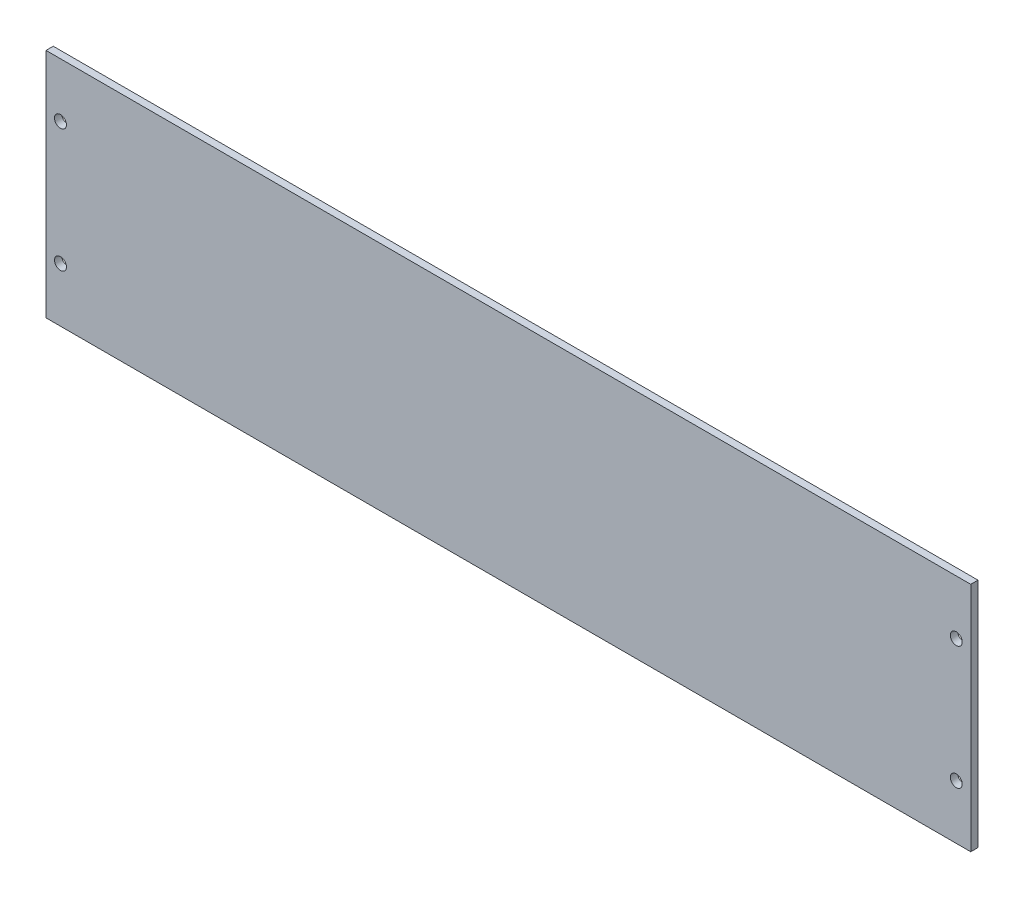
ISO-10303-21;
HEADER;
FILE_DESCRIPTION(('STEP AP214'),'2;1');
FILE_NAME('part.step','',(''),(''),'','','');
FILE_SCHEMA(('AUTOMOTIVE_DESIGN { 1 0 10303 214 1 1 1 1 }'));
ENDSEC;
DATA;
#1=APPLICATION_CONTEXT('core data for automotive mechanical design processes');
#2=APPLICATION_PROTOCOL_DEFINITION('international standard','automotive_design',2000,#1);
#3=PRODUCT_CONTEXT('',#1,'mechanical');
#4=PRODUCT('Part','Part','',(#3));
#5=PRODUCT_RELATED_PRODUCT_CATEGORY('part','',(#4));
#6=PRODUCT_DEFINITION_FORMATION('','',#4);
#7=PRODUCT_DEFINITION_CONTEXT('part definition',#1,'design');
#8=PRODUCT_DEFINITION('design','',#6,#7);
#9=PRODUCT_DEFINITION_SHAPE('','',#8);
#10=(LENGTH_UNIT() NAMED_UNIT(*) SI_UNIT(.MILLI.,.METRE.));
#11=(NAMED_UNIT(*) PLANE_ANGLE_UNIT() SI_UNIT($,.RADIAN.));
#12=(NAMED_UNIT(*) SI_UNIT($,.STERADIAN.) SOLID_ANGLE_UNIT());
#13=UNCERTAINTY_MEASURE_WITH_UNIT(LENGTH_MEASURE(1.E-05),#10,'distance_accuracy_value','');
#14=(GEOMETRIC_REPRESENTATION_CONTEXT(3) GLOBAL_UNCERTAINTY_ASSIGNED_CONTEXT((#13)) GLOBAL_UNIT_ASSIGNED_CONTEXT((#10,
#11,#12)) REPRESENTATION_CONTEXT('',''));
#15=CARTESIAN_POINT('',(0.,0.,0.));
#16=DIRECTION('',(0.,0.,1.));
#17=DIRECTION('',(1.,0.,0.));
#18=AXIS2_PLACEMENT_3D('',#15,#16,#17);
#19=CARTESIAN_POINT('',(255.5,-64.,4.));
#20=DIRECTION('',(-1.,0.,0.));
#21=DIRECTION('',(0.,0.,1.));
#22=AXIS2_PLACEMENT_3D('',#19,#20,#21);
#23=PLANE('',#22);
#24=DIRECTION('',(0.,1.,0.));
#25=VECTOR('',#24,1.);
#26=CARTESIAN_POINT('',(255.5,-64.,0.));
#27=LINE('',#26,#25);
#28=CARTESIAN_POINT('',(255.5,-64.,0.));
#29=VERTEX_POINT('',#28);
#30=CARTESIAN_POINT('',(255.5,64.,0.));
#31=VERTEX_POINT('',#30);
#32=EDGE_CURVE('E96',#29,#31,#27,.T.);
#33=ORIENTED_EDGE('',*,*,#32,.T.);
#34=DIRECTION('',(0.,0.,-1.));
#35=VECTOR('',#34,1.);
#36=CARTESIAN_POINT('',(255.5,64.,4.));
#37=LINE('',#36,#35);
#38=CARTESIAN_POINT('',(255.5,64.,4.));
#39=VERTEX_POINT('',#38);
#40=EDGE_CURVE('E11',#39,#31,#37,.T.);
#41=ORIENTED_EDGE('',*,*,#40,.F.);
#42=DIRECTION('',(0.,1.,0.));
#43=VECTOR('',#42,1.);
#44=CARTESIAN_POINT('',(255.5,-64.,4.));
#45=LINE('',#44,#43);
#46=CARTESIAN_POINT('',(255.5,-64.,4.));
#47=VERTEX_POINT('',#46);
#48=EDGE_CURVE('E84',#47,#39,#45,.T.);
#49=ORIENTED_EDGE('',*,*,#48,.F.);
#50=DIRECTION('',(0.,0.,-1.));
#51=VECTOR('',#50,1.);
#52=CARTESIAN_POINT('',(255.5,-64.,4.));
#53=LINE('',#52,#51);
#54=EDGE_CURVE('E92',#47,#29,#53,.T.);
#55=ORIENTED_EDGE('',*,*,#54,.T.);
#56=EDGE_LOOP('',(#33,#41,#49,#55));
#57=FACE_BOUND('',#56,.T.);
#58=ADVANCED_FACE('F33',(#57),#23,.F.);
#59=CARTESIAN_POINT('',(-255.5,64.,4.));
#60=DIRECTION('',(0.,-1.,0.));
#61=DIRECTION('',(0.,0.,-1.));
#62=AXIS2_PLACEMENT_3D('',#59,#60,#61);
#63=PLANE('',#62);
#64=DIRECTION('',(-1.,0.,0.));
#65=VECTOR('',#64,1.);
#66=CARTESIAN_POINT('',(-255.5,64.,0.));
#67=LINE('',#66,#65);
#68=CARTESIAN_POINT('',(-255.5,64.,0.));
#69=VERTEX_POINT('',#68);
#70=EDGE_CURVE('E88',#31,#69,#67,.T.);
#71=ORIENTED_EDGE('',*,*,#70,.T.);
#72=DIRECTION('',(0.,0.,-1.));
#73=VECTOR('',#72,1.);
#74=CARTESIAN_POINT('',(-255.5,64.,4.));
#75=LINE('',#74,#73);
#76=CARTESIAN_POINT('',(-255.5,64.,4.));
#77=VERTEX_POINT('',#76);
#78=EDGE_CURVE('E41',#77,#69,#75,.T.);
#79=ORIENTED_EDGE('',*,*,#78,.F.);
#80=DIRECTION('',(-1.,0.,0.));
#81=VECTOR('',#80,1.);
#82=CARTESIAN_POINT('',(-255.5,64.,4.));
#83=LINE('',#82,#81);
#84=EDGE_CURVE('E79',#39,#77,#83,.T.);
#85=ORIENTED_EDGE('',*,*,#84,.F.);
#86=ORIENTED_EDGE('',*,*,#40,.T.);
#87=EDGE_LOOP('',(#71,#79,#85,#86));
#88=FACE_BOUND('',#87,.T.);
#89=ADVANCED_FACE('F87',(#88),#63,.F.);
#90=CARTESIAN_POINT('',(-255.5,-64.,4.));
#91=DIRECTION('',(1.,0.,0.));
#92=DIRECTION('',(0.,0.,-1.));
#93=AXIS2_PLACEMENT_3D('',#90,#91,#92);
#94=PLANE('',#93);
#95=DIRECTION('',(0.,-1.,0.));
#96=VECTOR('',#95,1.);
#97=CARTESIAN_POINT('',(-255.5,-64.,0.));
#98=LINE('',#97,#96);
#99=CARTESIAN_POINT('',(-255.5,-64.,0.));
#100=VERTEX_POINT('',#99);
#101=EDGE_CURVE('E66',#69,#100,#98,.T.);
#102=ORIENTED_EDGE('',*,*,#101,.T.);
#103=DIRECTION('',(0.,0.,-1.));
#104=VECTOR('',#103,1.);
#105=CARTESIAN_POINT('',(-255.5,-64.,4.));
#106=LINE('',#105,#104);
#107=CARTESIAN_POINT('',(-255.5,-64.,4.));
#108=VERTEX_POINT('',#107);
#109=EDGE_CURVE('E89',#108,#100,#106,.T.);
#110=ORIENTED_EDGE('',*,*,#109,.F.);
#111=DIRECTION('',(0.,-1.,0.));
#112=VECTOR('',#111,1.);
#113=CARTESIAN_POINT('',(-255.5,-64.,4.));
#114=LINE('',#113,#112);
#115=EDGE_CURVE('E82',#77,#108,#114,.T.);
#116=ORIENTED_EDGE('',*,*,#115,.F.);
#117=ORIENTED_EDGE('',*,*,#78,.T.);
#118=EDGE_LOOP('',(#102,#110,#116,#117));
#119=FACE_BOUND('',#118,.T.);
#120=ADVANCED_FACE('F90',(#119),#94,.F.);
#121=CARTESIAN_POINT('',(-255.5,-64.,4.));
#122=DIRECTION('',(0.,1.,0.));
#123=DIRECTION('',(0.,0.,1.));
#124=AXIS2_PLACEMENT_3D('',#121,#122,#123);
#125=PLANE('',#124);
#126=DIRECTION('',(1.,0.,0.));
#127=VECTOR('',#126,1.);
#128=CARTESIAN_POINT('',(-255.5,-64.,0.));
#129=LINE('',#128,#127);
#130=EDGE_CURVE('E72',#100,#29,#129,.T.);
#131=ORIENTED_EDGE('',*,*,#130,.T.);
#132=ORIENTED_EDGE('',*,*,#54,.F.);
#133=DIRECTION('',(1.,0.,0.));
#134=VECTOR('',#133,1.);
#135=CARTESIAN_POINT('',(-255.5,-64.,4.));
#136=LINE('',#135,#134);
#137=EDGE_CURVE('E49',#108,#47,#136,.T.);
#138=ORIENTED_EDGE('',*,*,#137,.F.);
#139=ORIENTED_EDGE('',*,*,#109,.T.);
#140=EDGE_LOOP('',(#131,#132,#138,#139));
#141=FACE_BOUND('',#140,.T.);
#142=ADVANCED_FACE('F104',(#141),#125,.F.);
#143=CARTESIAN_POINT('',(0.,0.,4.));
#144=DIRECTION('',(0.,0.,-1.));
#145=DIRECTION('',(-1.,0.,0.));
#146=AXIS2_PLACEMENT_3D('',#143,#144,#145);
#147=PLANE('',#146);
#148=CARTESIAN_POINT('',(-247.5,34.,4.));
#149=DIRECTION('',(0.,0.,-1.));
#150=DIRECTION('',(-1.,0.,0.));
#151=AXIS2_PLACEMENT_3D('',#148,#149,#150);
#152=CIRCLE('',#151,3.3);
#153=CARTESIAN_POINT('',(-250.8,34.,4.));
#154=VERTEX_POINT('',#153);
#155=EDGE_CURVE('E127',#154,#154,#152,.T.);
#156=ORIENTED_EDGE('',*,*,#155,.T.);
#157=EDGE_LOOP('',(#156));
#158=FACE_BOUND('',#157,.T.);
#159=CARTESIAN_POINT('',(-247.5,-34.,4.));
#160=DIRECTION('',(0.,0.,-1.));
#161=DIRECTION('',(-1.,0.,0.));
#162=AXIS2_PLACEMENT_3D('',#159,#160,#161);
#163=CIRCLE('',#162,3.3);
#164=CARTESIAN_POINT('',(-250.8,-34.,4.));
#165=VERTEX_POINT('',#164);
#166=EDGE_CURVE('E121',#165,#165,#163,.T.);
#167=ORIENTED_EDGE('',*,*,#166,.T.);
#168=EDGE_LOOP('',(#167));
#169=FACE_BOUND('',#168,.T.);
#170=CARTESIAN_POINT('',(247.5,-34.,4.));
#171=DIRECTION('',(0.,0.,-1.));
#172=DIRECTION('',(-1.,0.,0.));
#173=AXIS2_PLACEMENT_3D('',#170,#171,#172);
#174=CIRCLE('',#173,3.29999999999997);
#175=CARTESIAN_POINT('',(244.2,-34.,4.));
#176=VERTEX_POINT('',#175);
#177=EDGE_CURVE('E115',#176,#176,#174,.T.);
#178=ORIENTED_EDGE('',*,*,#177,.T.);
#179=EDGE_LOOP('',(#178));
#180=FACE_BOUND('',#179,.T.);
#181=CARTESIAN_POINT('',(247.5,34.,4.));
#182=DIRECTION('',(0.,0.,-1.));
#183=DIRECTION('',(-1.,0.,0.));
#184=AXIS2_PLACEMENT_3D('',#181,#182,#183);
#185=CIRCLE('',#184,3.29999999999997);
#186=CARTESIAN_POINT('',(244.2,34.,4.));
#187=VERTEX_POINT('',#186);
#188=EDGE_CURVE('E99',#187,#187,#185,.T.);
#189=ORIENTED_EDGE('',*,*,#188,.T.);
#190=EDGE_LOOP('',(#189));
#191=FACE_BOUND('',#190,.T.);
#192=ORIENTED_EDGE('',*,*,#48,.T.);
#193=ORIENTED_EDGE('',*,*,#84,.T.);
#194=ORIENTED_EDGE('',*,*,#115,.T.);
#195=ORIENTED_EDGE('',*,*,#137,.T.);
#196=EDGE_LOOP('',(#192,#193,#194,#195));
#197=FACE_BOUND('',#196,.T.);
#198=ADVANCED_FACE('F80',(#158,#169,#180,#191,#197),#147,.F.);
#199=CARTESIAN_POINT('',(0.,0.,0.));
#200=DIRECTION('',(0.,0.,-1.));
#201=DIRECTION('',(-1.,0.,0.));
#202=AXIS2_PLACEMENT_3D('',#199,#200,#201);
#203=PLANE('',#202);
#204=CARTESIAN_POINT('',(-247.5,34.,0.));
#205=DIRECTION('',(0.,0.,-1.));
#206=DIRECTION('',(-1.,0.,0.));
#207=AXIS2_PLACEMENT_3D('',#204,#205,#206);
#208=CIRCLE('',#207,3.3);
#209=CARTESIAN_POINT('',(-250.8,34.,0.));
#210=VERTEX_POINT('',#209);
#211=EDGE_CURVE('E130',#210,#210,#208,.T.);
#212=ORIENTED_EDGE('',*,*,#211,.F.);
#213=EDGE_LOOP('',(#212));
#214=FACE_BOUND('',#213,.T.);
#215=CARTESIAN_POINT('',(-247.5,-34.,0.));
#216=DIRECTION('',(0.,0.,-1.));
#217=DIRECTION('',(-1.,0.,0.));
#218=AXIS2_PLACEMENT_3D('',#215,#216,#217);
#219=CIRCLE('',#218,3.3);
#220=CARTESIAN_POINT('',(-250.8,-34.,0.));
#221=VERTEX_POINT('',#220);
#222=EDGE_CURVE('E124',#221,#221,#219,.T.);
#223=ORIENTED_EDGE('',*,*,#222,.F.);
#224=EDGE_LOOP('',(#223));
#225=FACE_BOUND('',#224,.T.);
#226=CARTESIAN_POINT('',(247.5,-34.,0.));
#227=DIRECTION('',(0.,0.,-1.));
#228=DIRECTION('',(-1.,0.,0.));
#229=AXIS2_PLACEMENT_3D('',#226,#227,#228);
#230=CIRCLE('',#229,3.29999999999997);
#231=CARTESIAN_POINT('',(244.2,-34.,0.));
#232=VERTEX_POINT('',#231);
#233=EDGE_CURVE('E118',#232,#232,#230,.T.);
#234=ORIENTED_EDGE('',*,*,#233,.F.);
#235=EDGE_LOOP('',(#234));
#236=FACE_BOUND('',#235,.T.);
#237=CARTESIAN_POINT('',(247.5,34.,0.));
#238=DIRECTION('',(0.,0.,-1.));
#239=DIRECTION('',(-1.,0.,0.));
#240=AXIS2_PLACEMENT_3D('',#237,#238,#239);
#241=CIRCLE('',#240,3.29999999999997);
#242=CARTESIAN_POINT('',(244.2,34.,0.));
#243=VERTEX_POINT('',#242);
#244=EDGE_CURVE('E112',#243,#243,#241,.T.);
#245=ORIENTED_EDGE('',*,*,#244,.F.);
#246=EDGE_LOOP('',(#245));
#247=FACE_BOUND('',#246,.T.);
#248=ORIENTED_EDGE('',*,*,#32,.F.);
#249=ORIENTED_EDGE('',*,*,#130,.F.);
#250=ORIENTED_EDGE('',*,*,#101,.F.);
#251=ORIENTED_EDGE('',*,*,#70,.F.);
#252=EDGE_LOOP('',(#248,#249,#250,#251));
#253=FACE_BOUND('',#252,.T.);
#254=ADVANCED_FACE('F107',(#214,#225,#236,#247,#253),#203,.T.);
#255=CARTESIAN_POINT('',(247.5,34.,0.));
#256=DIRECTION('',(0.,0.,-1.));
#257=DIRECTION('',(-1.,0.,0.));
#258=AXIS2_PLACEMENT_3D('',#255,#256,#257);
#259=CYLINDRICAL_SURFACE('',#258,3.29999999999997);
#260=ORIENTED_EDGE('',*,*,#188,.F.);
#261=EDGE_LOOP('',(#260));
#262=FACE_BOUND('',#261,.T.);
#263=ORIENTED_EDGE('',*,*,#244,.T.);
#264=EDGE_LOOP('',(#263));
#265=FACE_BOUND('',#264,.T.);
#266=ADVANCED_FACE('F138',(#262,#265),#259,.F.);
#267=CARTESIAN_POINT('',(247.5,-34.,0.));
#268=DIRECTION('',(0.,0.,-1.));
#269=DIRECTION('',(-1.,0.,0.));
#270=AXIS2_PLACEMENT_3D('',#267,#268,#269);
#271=CYLINDRICAL_SURFACE('',#270,3.29999999999997);
#272=ORIENTED_EDGE('',*,*,#177,.F.);
#273=EDGE_LOOP('',(#272));
#274=FACE_BOUND('',#273,.T.);
#275=ORIENTED_EDGE('',*,*,#233,.T.);
#276=EDGE_LOOP('',(#275));
#277=FACE_BOUND('',#276,.T.);
#278=ADVANCED_FACE('F147',(#274,#277),#271,.F.);
#279=CARTESIAN_POINT('',(-247.5,-34.,0.));
#280=DIRECTION('',(0.,0.,-1.));
#281=DIRECTION('',(-1.,0.,0.));
#282=AXIS2_PLACEMENT_3D('',#279,#280,#281);
#283=CYLINDRICAL_SURFACE('',#282,3.3);
#284=ORIENTED_EDGE('',*,*,#166,.F.);
#285=EDGE_LOOP('',(#284));
#286=FACE_BOUND('',#285,.T.);
#287=ORIENTED_EDGE('',*,*,#222,.T.);
#288=EDGE_LOOP('',(#287));
#289=FACE_BOUND('',#288,.T.);
#290=ADVANCED_FACE('F153',(#286,#289),#283,.F.);
#291=CARTESIAN_POINT('',(-247.5,34.,0.));
#292=DIRECTION('',(0.,0.,-1.));
#293=DIRECTION('',(-1.,0.,0.));
#294=AXIS2_PLACEMENT_3D('',#291,#292,#293);
#295=CYLINDRICAL_SURFACE('',#294,3.3);
#296=ORIENTED_EDGE('',*,*,#155,.F.);
#297=EDGE_LOOP('',(#296));
#298=FACE_BOUND('',#297,.T.);
#299=ORIENTED_EDGE('',*,*,#211,.T.);
#300=EDGE_LOOP('',(#299));
#301=FACE_BOUND('',#300,.T.);
#302=ADVANCED_FACE('F134',(#298,#301),#295,.F.);
#303=CLOSED_SHELL('',(#58,#89,#120,#142,#198,#254,#266,#278,#290,#302));
#304=MANIFOLD_SOLID_BREP('B2',#303);
#305=ADVANCED_BREP_SHAPE_REPRESENTATION('',(#18,#304),#14);
#306=SHAPE_DEFINITION_REPRESENTATION(#9,#305);
ENDSEC;
END-ISO-10303-21;
